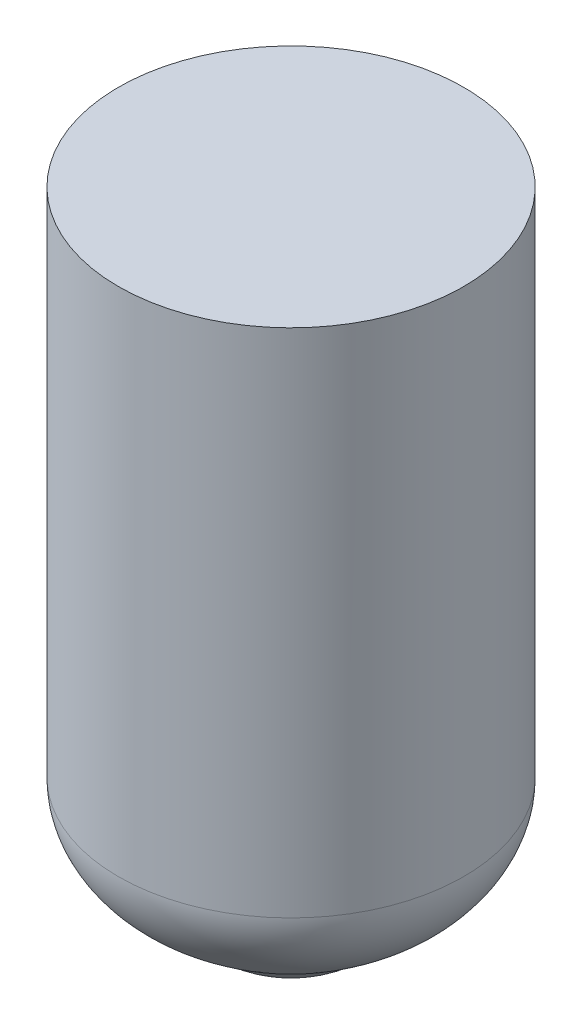
ISO-10303-21;
HEADER;
FILE_DESCRIPTION(('STEP AP214'),'2;1');
FILE_NAME('part.step','',(''),(''),'','','');
FILE_SCHEMA(('AUTOMOTIVE_DESIGN { 1 0 10303 214 1 1 1 1 }'));
ENDSEC;
DATA;
#1=APPLICATION_CONTEXT('core data for automotive mechanical design processes');
#2=APPLICATION_PROTOCOL_DEFINITION('international standard','automotive_design',2000,#1);
#3=PRODUCT_CONTEXT('',#1,'mechanical');
#4=PRODUCT('Part','Part','',(#3));
#5=PRODUCT_RELATED_PRODUCT_CATEGORY('part','',(#4));
#6=PRODUCT_DEFINITION_FORMATION('','',#4);
#7=PRODUCT_DEFINITION_CONTEXT('part definition',#1,'design');
#8=PRODUCT_DEFINITION('design','',#6,#7);
#9=PRODUCT_DEFINITION_SHAPE('','',#8);
#10=(LENGTH_UNIT() NAMED_UNIT(*) SI_UNIT(.MILLI.,.METRE.));
#11=(NAMED_UNIT(*) PLANE_ANGLE_UNIT() SI_UNIT($,.RADIAN.));
#12=(NAMED_UNIT(*) SI_UNIT($,.STERADIAN.) SOLID_ANGLE_UNIT());
#13=UNCERTAINTY_MEASURE_WITH_UNIT(LENGTH_MEASURE(1.E-05),#10,'distance_accuracy_value','');
#14=(GEOMETRIC_REPRESENTATION_CONTEXT(3) GLOBAL_UNCERTAINTY_ASSIGNED_CONTEXT((#13)) GLOBAL_UNIT_ASSIGNED_CONTEXT((#10,
#11,#12)) REPRESENTATION_CONTEXT('',''));
#15=CARTESIAN_POINT('',(0.,0.,0.));
#16=DIRECTION('',(0.,0.,1.));
#17=DIRECTION('',(1.,0.,0.));
#18=AXIS2_PLACEMENT_3D('',#15,#16,#17);
#19=CARTESIAN_POINT('',(-30.4,25.,0.));
#20=CARTESIAN_POINT('',(-30.4,20.5202503243729,0.));
#21=CARTESIAN_POINT('',(-26.1027673510133,12.4146521889742,0.));
#22=CARTESIAN_POINT('',(-12.538391124572,4.76064634632737,0.));
#23=CARTESIAN_POINT('',(-10.5314775985347,0.,0.));
#24=CARTESIAN_POINT('',(0.,0.,0.));
#25=B_SPLINE_CURVE_WITH_KNOTS('',3,(#19,#20,#21,#22,#23,#24),.UNSPECIFIED.,.F.,.F.,(4,1,1,4),
(0.,0.316664229085212,0.611734607893979,1.),.UNSPECIFIED.);
#26=CARTESIAN_POINT('',(0.,115.,0.));
#27=DIRECTION('',(0.,1.,0.));
#28=AXIS1_PLACEMENT('',#26,#27);
#29=SURFACE_OF_REVOLUTION('',#25,#28);
#30=CARTESIAN_POINT('',(0.,0.,0.));
#31=VERTEX_POINT('',#30);
#32=VERTEX_LOOP('',#31);
#33=FACE_BOUND('',#32,.T.);
#34=CARTESIAN_POINT('',(0.,25.,0.));
#35=DIRECTION('',(0.,1.,0.));
#36=DIRECTION('',(0.,0.,1.));
#37=AXIS2_PLACEMENT_3D('',#34,#35,#36);
#38=CIRCLE('',#37,30.4);
#39=CARTESIAN_POINT('',(0.,25.,30.4));
#40=VERTEX_POINT('',#39);
#41=EDGE_CURVE('E40',#40,#40,#38,.T.);
#42=ORIENTED_EDGE('',*,*,#41,.F.);
#43=EDGE_LOOP('',(#42));
#44=FACE_BOUND('',#43,.T.);
#45=ADVANCED_FACE('F33',(#33,#44),#29,.F.);
#46=CARTESIAN_POINT('',(-30.4,115.,0.));
#47=DIRECTION('',(0.,1.,0.));
#48=DIRECTION('',(0.,0.,1.));
#49=AXIS2_PLACEMENT_3D('',#46,#47,#48);
#50=PLANE('',#49);
#51=CARTESIAN_POINT('',(0.,115.,0.));
#52=DIRECTION('',(0.,1.,0.));
#53=DIRECTION('',(0.,0.,1.));
#54=AXIS2_PLACEMENT_3D('',#51,#52,#53);
#55=CIRCLE('',#54,30.4);
#56=CARTESIAN_POINT('',(0.,115.,30.4));
#57=VERTEX_POINT('',#56);
#58=EDGE_CURVE('E11',#57,#57,#55,.T.);
#59=ORIENTED_EDGE('',*,*,#58,.T.);
#60=EDGE_LOOP('',(#59));
#61=FACE_BOUND('',#60,.T.);
#62=ADVANCED_FACE('F45',(#61),#50,.T.);
#63=CARTESIAN_POINT('',(0.,115.,0.));
#64=DIRECTION('',(0.,1.,0.));
#65=DIRECTION('',(0.,0.,1.));
#66=AXIS2_PLACEMENT_3D('',#63,#64,#65);
#67=CYLINDRICAL_SURFACE('',#66,30.4);
#68=ORIENTED_EDGE('',*,*,#41,.T.);
#69=EDGE_LOOP('',(#68));
#70=FACE_BOUND('',#69,.T.);
#71=ORIENTED_EDGE('',*,*,#58,.F.);
#72=EDGE_LOOP('',(#71));
#73=FACE_BOUND('',#72,.T.);
#74=ADVANCED_FACE('F55',(#70,#73),#67,.T.);
#75=CLOSED_SHELL('',(#45,#62,#74));
#76=MANIFOLD_SOLID_BREP('B2',#75);
#77=ADVANCED_BREP_SHAPE_REPRESENTATION('',(#18,#76),#14);
#78=SHAPE_DEFINITION_REPRESENTATION(#9,#77);
ENDSEC;
END-ISO-10303-21;
